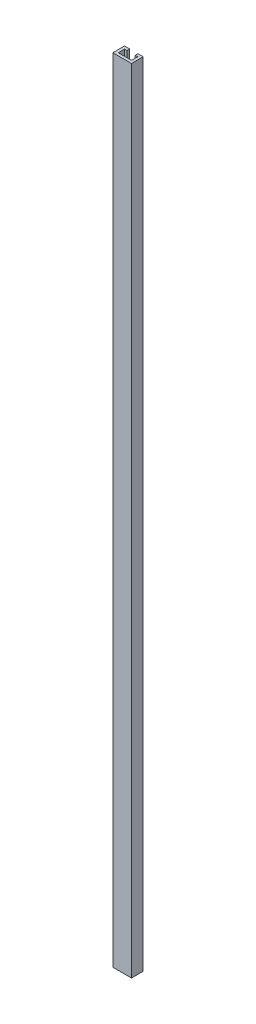
ISO-10303-21;
HEADER;
FILE_DESCRIPTION(('STEP AP214'),'2;1');
FILE_NAME('part.step','',(''),(''),'','','');
FILE_SCHEMA(('AUTOMOTIVE_DESIGN { 1 0 10303 214 1 1 1 1 }'));
ENDSEC;
DATA;
#1=APPLICATION_CONTEXT('core data for automotive mechanical design processes');
#2=APPLICATION_PROTOCOL_DEFINITION('international standard','automotive_design',2000,#1);
#3=PRODUCT_CONTEXT('',#1,'mechanical');
#4=PRODUCT('Part','Part','',(#3));
#5=PRODUCT_RELATED_PRODUCT_CATEGORY('part','',(#4));
#6=PRODUCT_DEFINITION_FORMATION('','',#4);
#7=PRODUCT_DEFINITION_CONTEXT('part definition',#1,'design');
#8=PRODUCT_DEFINITION('design','',#6,#7);
#9=PRODUCT_DEFINITION_SHAPE('','',#8);
#10=(LENGTH_UNIT() NAMED_UNIT(*) SI_UNIT(.MILLI.,.METRE.));
#11=(NAMED_UNIT(*) PLANE_ANGLE_UNIT() SI_UNIT($,.RADIAN.));
#12=(NAMED_UNIT(*) SI_UNIT($,.STERADIAN.) SOLID_ANGLE_UNIT());
#13=UNCERTAINTY_MEASURE_WITH_UNIT(LENGTH_MEASURE(1.E-05),#10,'distance_accuracy_value','');
#14=(GEOMETRIC_REPRESENTATION_CONTEXT(3) GLOBAL_UNCERTAINTY_ASSIGNED_CONTEXT((#13)) GLOBAL_UNIT_ASSIGNED_CONTEXT((#10,
#11,#12)) REPRESENTATION_CONTEXT('',''));
#15=CARTESIAN_POINT('',(0.,0.,0.));
#16=DIRECTION('',(0.,0.,1.));
#17=DIRECTION('',(1.,0.,0.));
#18=AXIS2_PLACEMENT_3D('',#15,#16,#17);
#19=CARTESIAN_POINT('',(0.,340.,0.));
#20=DIRECTION('',(1.,0.,0.));
#21=DIRECTION('',(0.,0.,-1.));
#22=AXIS2_PLACEMENT_3D('',#19,#20,#21);
#23=PLANE('',#22);
#24=DIRECTION('',(0.,0.,1.));
#25=VECTOR('',#24,1.);
#26=CARTESIAN_POINT('',(0.,0.,0.));
#27=LINE('',#26,#25);
#28=CARTESIAN_POINT('',(0.,0.,0.));
#29=VERTEX_POINT('',#28);
#30=CARTESIAN_POINT('',(0.,0.,5.));
#31=VERTEX_POINT('',#30);
#32=EDGE_CURVE('E164',#29,#31,#27,.T.);
#33=ORIENTED_EDGE('',*,*,#32,.T.);
#34=DIRECTION('',(0.,-1.,0.));
#35=VECTOR('',#34,1.);
#36=CARTESIAN_POINT('',(0.,340.,5.));
#37=LINE('',#36,#35);
#38=CARTESIAN_POINT('',(0.,340.,5.));
#39=VERTEX_POINT('',#38);
#40=EDGE_CURVE('E11',#39,#31,#37,.T.);
#41=ORIENTED_EDGE('',*,*,#40,.F.);
#42=DIRECTION('',(0.,0.,1.));
#43=VECTOR('',#42,1.);
#44=CARTESIAN_POINT('',(0.,340.,0.));
#45=LINE('',#44,#43);
#46=CARTESIAN_POINT('',(0.,340.,0.));
#47=VERTEX_POINT('',#46);
#48=EDGE_CURVE('E198',#47,#39,#45,.T.);
#49=ORIENTED_EDGE('',*,*,#48,.F.);
#50=DIRECTION('',(0.,-1.,0.));
#51=VECTOR('',#50,1.);
#52=CARTESIAN_POINT('',(0.,340.,0.));
#53=LINE('',#52,#51);
#54=EDGE_CURVE('E160',#47,#29,#53,.T.);
#55=ORIENTED_EDGE('',*,*,#54,.T.);
#56=EDGE_LOOP('',(#33,#41,#49,#55));
#57=FACE_BOUND('',#56,.T.);
#58=ADVANCED_FACE('F39',(#57),#23,.F.);
#59=CARTESIAN_POINT('',(0.,340.,5.));
#60=DIRECTION('',(0.,0.,-1.));
#61=DIRECTION('',(-1.,0.,0.));
#62=AXIS2_PLACEMENT_3D('',#59,#60,#61);
#63=PLANE('',#62);
#64=DIRECTION('',(1.,0.,0.));
#65=VECTOR('',#64,1.);
#66=CARTESIAN_POINT('',(0.,0.,5.));
#67=LINE('',#66,#65);
#68=CARTESIAN_POINT('',(8.,0.,5.));
#69=VERTEX_POINT('',#68);
#70=EDGE_CURVE('E168',#31,#69,#67,.T.);
#71=ORIENTED_EDGE('',*,*,#70,.T.);
#72=DIRECTION('',(0.,-1.,0.));
#73=VECTOR('',#72,1.);
#74=CARTESIAN_POINT('',(8.,340.,5.));
#75=LINE('',#74,#73);
#76=CARTESIAN_POINT('',(8.,340.,5.));
#77=VERTEX_POINT('',#76);
#78=EDGE_CURVE('E48',#77,#69,#75,.T.);
#79=ORIENTED_EDGE('',*,*,#78,.F.);
#80=DIRECTION('',(1.,0.,0.));
#81=VECTOR('',#80,1.);
#82=CARTESIAN_POINT('',(0.,340.,5.));
#83=LINE('',#82,#81);
#84=EDGE_CURVE('E111',#39,#77,#83,.T.);
#85=ORIENTED_EDGE('',*,*,#84,.F.);
#86=ORIENTED_EDGE('',*,*,#40,.T.);
#87=EDGE_LOOP('',(#71,#79,#85,#86));
#88=FACE_BOUND('',#87,.T.);
#89=ADVANCED_FACE('F292',(#88),#63,.F.);
#90=CARTESIAN_POINT('',(8.,340.,5.));
#91=DIRECTION('',(-1.,0.,0.));
#92=DIRECTION('',(0.,0.,1.));
#93=AXIS2_PLACEMENT_3D('',#90,#91,#92);
#94=PLANE('',#93);
#95=DIRECTION('',(0.,0.,-1.));
#96=VECTOR('',#95,1.);
#97=CARTESIAN_POINT('',(8.,0.,5.));
#98=LINE('',#97,#96);
#99=CARTESIAN_POINT('',(8.,0.,0.));
#100=VERTEX_POINT('',#99);
#101=EDGE_CURVE('E171',#69,#100,#98,.T.);
#102=ORIENTED_EDGE('',*,*,#101,.T.);
#103=DIRECTION('',(0.,-1.,0.));
#104=VECTOR('',#103,1.);
#105=CARTESIAN_POINT('',(8.,340.,0.));
#106=LINE('',#105,#104);
#107=CARTESIAN_POINT('',(8.,340.,0.));
#108=VERTEX_POINT('',#107);
#109=EDGE_CURVE('E225',#108,#100,#106,.T.);
#110=ORIENTED_EDGE('',*,*,#109,.F.);
#111=DIRECTION('',(0.,0.,-1.));
#112=VECTOR('',#111,1.);
#113=CARTESIAN_POINT('',(8.,340.,5.));
#114=LINE('',#113,#112);
#115=EDGE_CURVE('E235',#77,#108,#114,.T.);
#116=ORIENTED_EDGE('',*,*,#115,.F.);
#117=ORIENTED_EDGE('',*,*,#78,.T.);
#118=EDGE_LOOP('',(#102,#110,#116,#117));
#119=FACE_BOUND('',#118,.T.);
#120=ADVANCED_FACE('F233',(#119),#94,.F.);
#121=CARTESIAN_POINT('',(8.,340.,0.));
#122=DIRECTION('',(0.,0.,1.));
#123=DIRECTION('',(1.,0.,0.));
#124=AXIS2_PLACEMENT_3D('',#121,#122,#123);
#125=PLANE('',#124);
#126=DIRECTION('',(-1.,0.,0.));
#127=VECTOR('',#126,1.);
#128=CARTESIAN_POINT('',(8.,0.,0.));
#129=LINE('',#128,#127);
#130=CARTESIAN_POINT('',(5.75,0.,0.));
#131=VERTEX_POINT('',#130);
#132=EDGE_CURVE('E174',#100,#131,#129,.T.);
#133=ORIENTED_EDGE('',*,*,#132,.T.);
#134=DIRECTION('',(0.,-1.,0.));
#135=VECTOR('',#134,1.);
#136=CARTESIAN_POINT('',(5.75,340.,0.));
#137=LINE('',#136,#135);
#138=CARTESIAN_POINT('',(5.75,340.,0.));
#139=VERTEX_POINT('',#138);
#140=EDGE_CURVE('E221',#139,#131,#137,.T.);
#141=ORIENTED_EDGE('',*,*,#140,.F.);
#142=DIRECTION('',(-1.,0.,0.));
#143=VECTOR('',#142,1.);
#144=CARTESIAN_POINT('',(8.,340.,0.));
#145=LINE('',#144,#143);
#146=EDGE_CURVE('E254',#108,#139,#145,.T.);
#147=ORIENTED_EDGE('',*,*,#146,.F.);
#148=ORIENTED_EDGE('',*,*,#109,.T.);
#149=EDGE_LOOP('',(#133,#141,#147,#148));
#150=FACE_BOUND('',#149,.T.);
#151=ADVANCED_FACE('F244',(#150),#125,.F.);
#152=CARTESIAN_POINT('',(5.75,340.,0.));
#153=DIRECTION('',(1.,0.,0.));
#154=DIRECTION('',(0.,0.,-1.));
#155=AXIS2_PLACEMENT_3D('',#152,#153,#154);
#156=PLANE('',#155);
#157=DIRECTION('',(0.,0.,1.));
#158=VECTOR('',#157,1.);
#159=CARTESIAN_POINT('',(5.75,0.,0.));
#160=LINE('',#159,#158);
#161=CARTESIAN_POINT('',(5.75,0.,1.15));
#162=VERTEX_POINT('',#161);
#163=EDGE_CURVE('E177',#131,#162,#160,.T.);
#164=ORIENTED_EDGE('',*,*,#163,.T.);
#165=DIRECTION('',(0.,-1.,0.));
#166=VECTOR('',#165,1.);
#167=CARTESIAN_POINT('',(5.75,340.,1.15));
#168=LINE('',#167,#166);
#169=CARTESIAN_POINT('',(5.75,340.,1.15));
#170=VERTEX_POINT('',#169);
#171=EDGE_CURVE('E217',#170,#162,#168,.T.);
#172=ORIENTED_EDGE('',*,*,#171,.F.);
#173=DIRECTION('',(0.,0.,1.));
#174=VECTOR('',#173,1.);
#175=CARTESIAN_POINT('',(5.75,340.,0.));
#176=LINE('',#175,#174);
#177=EDGE_CURVE('E250',#139,#170,#176,.T.);
#178=ORIENTED_EDGE('',*,*,#177,.F.);
#179=ORIENTED_EDGE('',*,*,#140,.T.);
#180=EDGE_LOOP('',(#164,#172,#178,#179));
#181=FACE_BOUND('',#180,.T.);
#182=ADVANCED_FACE('F248',(#181),#156,.F.);
#183=CARTESIAN_POINT('',(5.75,340.,1.15));
#184=DIRECTION('',(0.,0.,-1.));
#185=DIRECTION('',(-1.,0.,0.));
#186=AXIS2_PLACEMENT_3D('',#183,#184,#185);
#187=PLANE('',#186);
#188=DIRECTION('',(1.,0.,0.));
#189=VECTOR('',#188,1.);
#190=CARTESIAN_POINT('',(5.75,0.,1.15));
#191=LINE('',#190,#189);
#192=CARTESIAN_POINT('',(6.85,0.,1.15));
#193=VERTEX_POINT('',#192);
#194=EDGE_CURVE('E180',#162,#193,#191,.T.);
#195=ORIENTED_EDGE('',*,*,#194,.T.);
#196=DIRECTION('',(0.,-1.,0.));
#197=VECTOR('',#196,1.);
#198=CARTESIAN_POINT('',(6.85,340.,1.15));
#199=LINE('',#198,#197);
#200=CARTESIAN_POINT('',(6.85,340.,1.15));
#201=VERTEX_POINT('',#200);
#202=EDGE_CURVE('E213',#201,#193,#199,.T.);
#203=ORIENTED_EDGE('',*,*,#202,.F.);
#204=DIRECTION('',(1.,0.,0.));
#205=VECTOR('',#204,1.);
#206=CARTESIAN_POINT('',(5.75,340.,1.15));
#207=LINE('',#206,#205);
#208=EDGE_CURVE('E253',#170,#201,#207,.T.);
#209=ORIENTED_EDGE('',*,*,#208,.F.);
#210=ORIENTED_EDGE('',*,*,#171,.T.);
#211=EDGE_LOOP('',(#195,#203,#209,#210));
#212=FACE_BOUND('',#211,.T.);
#213=ADVANCED_FACE('F305',(#212),#187,.F.);
#214=CARTESIAN_POINT('',(6.85,340.,1.15));
#215=DIRECTION('',(1.,0.,0.));
#216=DIRECTION('',(0.,0.,-1.));
#217=AXIS2_PLACEMENT_3D('',#214,#215,#216);
#218=PLANE('',#217);
#219=DIRECTION('',(0.,0.,1.));
#220=VECTOR('',#219,1.);
#221=CARTESIAN_POINT('',(6.85,0.,1.15));
#222=LINE('',#221,#220);
#223=CARTESIAN_POINT('',(6.85,0.,3.85));
#224=VERTEX_POINT('',#223);
#225=EDGE_CURVE('E183',#193,#224,#222,.T.);
#226=ORIENTED_EDGE('',*,*,#225,.T.);
#227=DIRECTION('',(0.,-1.,0.));
#228=VECTOR('',#227,1.);
#229=CARTESIAN_POINT('',(6.85,340.,3.85));
#230=LINE('',#229,#228);
#231=CARTESIAN_POINT('',(6.85,340.,3.85));
#232=VERTEX_POINT('',#231);
#233=EDGE_CURVE('E209',#232,#224,#230,.T.);
#234=ORIENTED_EDGE('',*,*,#233,.F.);
#235=DIRECTION('',(0.,0.,1.));
#236=VECTOR('',#235,1.);
#237=CARTESIAN_POINT('',(6.85,340.,1.15));
#238=LINE('',#237,#236);
#239=EDGE_CURVE('E258',#201,#232,#238,.T.);
#240=ORIENTED_EDGE('',*,*,#239,.F.);
#241=ORIENTED_EDGE('',*,*,#202,.T.);
#242=EDGE_LOOP('',(#226,#234,#240,#241));
#243=FACE_BOUND('',#242,.T.);
#244=ADVANCED_FACE('F308',(#243),#218,.F.);
#245=CARTESIAN_POINT('',(6.85,340.,3.85));
#246=DIRECTION('',(0.,0.,1.));
#247=DIRECTION('',(1.,0.,0.));
#248=AXIS2_PLACEMENT_3D('',#245,#246,#247);
#249=PLANE('',#248);
#250=DIRECTION('',(-1.,0.,0.));
#251=VECTOR('',#250,1.);
#252=CARTESIAN_POINT('',(6.85,0.,3.85));
#253=LINE('',#252,#251);
#254=CARTESIAN_POINT('',(1.15,0.,3.85));
#255=VERTEX_POINT('',#254);
#256=EDGE_CURVE('E186',#224,#255,#253,.T.);
#257=ORIENTED_EDGE('',*,*,#256,.T.);
#258=DIRECTION('',(0.,-1.,0.));
#259=VECTOR('',#258,1.);
#260=CARTESIAN_POINT('',(1.15,340.,3.85));
#261=LINE('',#260,#259);
#262=CARTESIAN_POINT('',(1.15,340.,3.85));
#263=VERTEX_POINT('',#262);
#264=EDGE_CURVE('E205',#263,#255,#261,.T.);
#265=ORIENTED_EDGE('',*,*,#264,.F.);
#266=DIRECTION('',(-1.,0.,0.));
#267=VECTOR('',#266,1.);
#268=CARTESIAN_POINT('',(6.85,340.,3.85));
#269=LINE('',#268,#267);
#270=EDGE_CURVE('E265',#232,#263,#269,.T.);
#271=ORIENTED_EDGE('',*,*,#270,.F.);
#272=ORIENTED_EDGE('',*,*,#233,.T.);
#273=EDGE_LOOP('',(#257,#265,#271,#272));
#274=FACE_BOUND('',#273,.T.);
#275=ADVANCED_FACE('F273',(#274),#249,.F.);
#276=CARTESIAN_POINT('',(1.15,340.,3.85));
#277=DIRECTION('',(-1.,0.,0.));
#278=DIRECTION('',(0.,0.,1.));
#279=AXIS2_PLACEMENT_3D('',#276,#277,#278);
#280=PLANE('',#279);
#281=DIRECTION('',(0.,0.,-1.));
#282=VECTOR('',#281,1.);
#283=CARTESIAN_POINT('',(1.15,0.,3.85));
#284=LINE('',#283,#282);
#285=CARTESIAN_POINT('',(1.15,0.,1.15));
#286=VERTEX_POINT('',#285);
#287=EDGE_CURVE('E189',#255,#286,#284,.T.);
#288=ORIENTED_EDGE('',*,*,#287,.T.);
#289=DIRECTION('',(0.,-1.,0.));
#290=VECTOR('',#289,1.);
#291=CARTESIAN_POINT('',(1.15,340.,1.15));
#292=LINE('',#291,#290);
#293=CARTESIAN_POINT('',(1.15,340.,1.15));
#294=VERTEX_POINT('',#293);
#295=EDGE_CURVE('E153',#294,#286,#292,.T.);
#296=ORIENTED_EDGE('',*,*,#295,.F.);
#297=DIRECTION('',(0.,0.,-1.));
#298=VECTOR('',#297,1.);
#299=CARTESIAN_POINT('',(1.15,340.,3.85));
#300=LINE('',#299,#298);
#301=EDGE_CURVE('E142',#263,#294,#300,.T.);
#302=ORIENTED_EDGE('',*,*,#301,.F.);
#303=ORIENTED_EDGE('',*,*,#264,.T.);
#304=EDGE_LOOP('',(#288,#296,#302,#303));
#305=FACE_BOUND('',#304,.T.);
#306=ADVANCED_FACE('F277',(#305),#280,.F.);
#307=CARTESIAN_POINT('',(1.15,340.,1.15));
#308=DIRECTION('',(0.,0.,-1.));
#309=DIRECTION('',(-1.,0.,0.));
#310=AXIS2_PLACEMENT_3D('',#307,#308,#309);
#311=PLANE('',#310);
#312=DIRECTION('',(1.,0.,0.));
#313=VECTOR('',#312,1.);
#314=CARTESIAN_POINT('',(1.15,0.,1.15));
#315=LINE('',#314,#313);
#316=CARTESIAN_POINT('',(2.25,0.,1.15));
#317=VERTEX_POINT('',#316);
#318=EDGE_CURVE('E151',#286,#317,#315,.T.);
#319=ORIENTED_EDGE('',*,*,#318,.T.);
#320=DIRECTION('',(0.,-1.,0.));
#321=VECTOR('',#320,1.);
#322=CARTESIAN_POINT('',(2.25,340.,1.15));
#323=LINE('',#322,#321);
#324=CARTESIAN_POINT('',(2.25,340.,1.15));
#325=VERTEX_POINT('',#324);
#326=EDGE_CURVE('E148',#325,#317,#323,.T.);
#327=ORIENTED_EDGE('',*,*,#326,.F.);
#328=DIRECTION('',(1.,0.,0.));
#329=VECTOR('',#328,1.);
#330=CARTESIAN_POINT('',(1.15,340.,1.15));
#331=LINE('',#330,#329);
#332=EDGE_CURVE('E136',#294,#325,#331,.T.);
#333=ORIENTED_EDGE('',*,*,#332,.F.);
#334=ORIENTED_EDGE('',*,*,#295,.T.);
#335=EDGE_LOOP('',(#319,#327,#333,#334));
#336=FACE_BOUND('',#335,.T.);
#337=ADVANCED_FACE('F149',(#336),#311,.F.);
#338=CARTESIAN_POINT('',(2.25,340.,1.15));
#339=DIRECTION('',(-1.,0.,0.));
#340=DIRECTION('',(0.,0.,1.));
#341=AXIS2_PLACEMENT_3D('',#338,#339,#340);
#342=PLANE('',#341);
#343=DIRECTION('',(0.,0.,-1.));
#344=VECTOR('',#343,1.);
#345=CARTESIAN_POINT('',(2.25,0.,1.15));
#346=LINE('',#345,#344);
#347=CARTESIAN_POINT('',(2.25,0.,0.));
#348=VERTEX_POINT('',#347);
#349=EDGE_CURVE('E97',#317,#348,#346,.T.);
#350=ORIENTED_EDGE('',*,*,#349,.T.);
#351=DIRECTION('',(0.,-1.,0.));
#352=VECTOR('',#351,1.);
#353=CARTESIAN_POINT('',(2.25,340.,0.));
#354=LINE('',#353,#352);
#355=CARTESIAN_POINT('',(2.25,340.,0.));
#356=VERTEX_POINT('',#355);
#357=EDGE_CURVE('E154',#356,#348,#354,.T.);
#358=ORIENTED_EDGE('',*,*,#357,.F.);
#359=DIRECTION('',(0.,0.,-1.));
#360=VECTOR('',#359,1.);
#361=CARTESIAN_POINT('',(2.25,340.,1.15));
#362=LINE('',#361,#360);
#363=EDGE_CURVE('E140',#325,#356,#362,.T.);
#364=ORIENTED_EDGE('',*,*,#363,.F.);
#365=ORIENTED_EDGE('',*,*,#326,.T.);
#366=EDGE_LOOP('',(#350,#358,#364,#365));
#367=FACE_BOUND('',#366,.T.);
#368=ADVANCED_FACE('F156',(#367),#342,.F.);
#369=CARTESIAN_POINT('',(2.25,340.,0.));
#370=DIRECTION('',(0.,0.,1.));
#371=DIRECTION('',(1.,0.,0.));
#372=AXIS2_PLACEMENT_3D('',#369,#370,#371);
#373=PLANE('',#372);
#374=DIRECTION('',(-1.,0.,0.));
#375=VECTOR('',#374,1.);
#376=CARTESIAN_POINT('',(2.25,0.,0.));
#377=LINE('',#376,#375);
#378=EDGE_CURVE('E103',#348,#29,#377,.T.);
#379=ORIENTED_EDGE('',*,*,#378,.T.);
#380=ORIENTED_EDGE('',*,*,#54,.F.);
#381=DIRECTION('',(-1.,0.,0.));
#382=VECTOR('',#381,1.);
#383=CARTESIAN_POINT('',(2.25,340.,0.));
#384=LINE('',#383,#382);
#385=EDGE_CURVE('E56',#356,#47,#384,.T.);
#386=ORIENTED_EDGE('',*,*,#385,.F.);
#387=ORIENTED_EDGE('',*,*,#357,.T.);
#388=EDGE_LOOP('',(#379,#380,#386,#387));
#389=FACE_BOUND('',#388,.T.);
#390=ADVANCED_FACE('F281',(#389),#373,.F.);
#391=CARTESIAN_POINT('',(0.,340.,0.));
#392=DIRECTION('',(0.,1.,0.));
#393=DIRECTION('',(0.,0.,1.));
#394=AXIS2_PLACEMENT_3D('',#391,#392,#393);
#395=PLANE('',#394);
#396=ORIENTED_EDGE('',*,*,#48,.T.);
#397=ORIENTED_EDGE('',*,*,#84,.T.);
#398=ORIENTED_EDGE('',*,*,#115,.T.);
#399=ORIENTED_EDGE('',*,*,#146,.T.);
#400=ORIENTED_EDGE('',*,*,#177,.T.);
#401=ORIENTED_EDGE('',*,*,#208,.T.);
#402=ORIENTED_EDGE('',*,*,#239,.T.);
#403=ORIENTED_EDGE('',*,*,#270,.T.);
#404=ORIENTED_EDGE('',*,*,#301,.T.);
#405=ORIENTED_EDGE('',*,*,#332,.T.);
#406=ORIENTED_EDGE('',*,*,#363,.T.);
#407=ORIENTED_EDGE('',*,*,#385,.T.);
#408=EDGE_LOOP('',(#396,#397,#398,#399,#400,#401,#402,#403,#404,#405,#406,#407));
#409=FACE_BOUND('',#408,.T.);
#410=ADVANCED_FACE('F138',(#409),#395,.T.);
#411=CARTESIAN_POINT('',(0.,0.,0.));
#412=DIRECTION('',(0.,1.,0.));
#413=DIRECTION('',(0.,0.,1.));
#414=AXIS2_PLACEMENT_3D('',#411,#412,#413);
#415=PLANE('',#414);
#416=ORIENTED_EDGE('',*,*,#32,.F.);
#417=ORIENTED_EDGE('',*,*,#378,.F.);
#418=ORIENTED_EDGE('',*,*,#349,.F.);
#419=ORIENTED_EDGE('',*,*,#318,.F.);
#420=ORIENTED_EDGE('',*,*,#287,.F.);
#421=ORIENTED_EDGE('',*,*,#256,.F.);
#422=ORIENTED_EDGE('',*,*,#225,.F.);
#423=ORIENTED_EDGE('',*,*,#194,.F.);
#424=ORIENTED_EDGE('',*,*,#163,.F.);
#425=ORIENTED_EDGE('',*,*,#132,.F.);
#426=ORIENTED_EDGE('',*,*,#101,.F.);
#427=ORIENTED_EDGE('',*,*,#70,.F.);
#428=EDGE_LOOP('',(#416,#417,#418,#419,#420,#421,#422,#423,#424,#425,#426,#427));
#429=FACE_BOUND('',#428,.T.);
#430=ADVANCED_FACE('F239',(#429),#415,.F.);
#431=CLOSED_SHELL('',(#58,#89,#120,#151,#182,#213,#244,#275,#306,#337,#368,#390,#410,#430));
#432=MANIFOLD_SOLID_BREP('B2',#431);
#433=ADVANCED_BREP_SHAPE_REPRESENTATION('',(#18,#432),#14);
#434=SHAPE_DEFINITION_REPRESENTATION(#9,#433);
ENDSEC;
END-ISO-10303-21;
